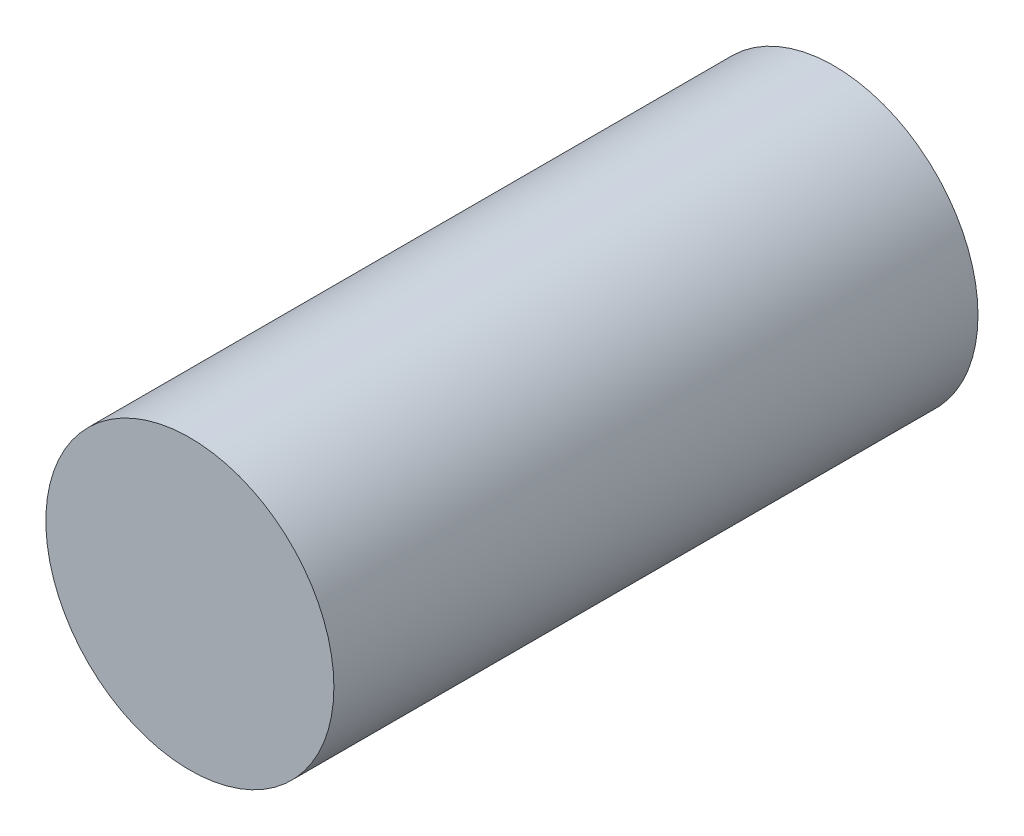
ISO-10303-21;
HEADER;
FILE_DESCRIPTION(('STEP AP214'),'2;1');
FILE_NAME('part.step','',(''),(''),'','','');
FILE_SCHEMA(('AUTOMOTIVE_DESIGN { 1 0 10303 214 1 1 1 1 }'));
ENDSEC;
DATA;
#1=APPLICATION_CONTEXT('core data for automotive mechanical design processes');
#2=APPLICATION_PROTOCOL_DEFINITION('international standard','automotive_design',2000,#1);
#3=PRODUCT_CONTEXT('',#1,'mechanical');
#4=PRODUCT('Part','Part','',(#3));
#5=PRODUCT_RELATED_PRODUCT_CATEGORY('part','',(#4));
#6=PRODUCT_DEFINITION_FORMATION('','',#4);
#7=PRODUCT_DEFINITION_CONTEXT('part definition',#1,'design');
#8=PRODUCT_DEFINITION('design','',#6,#7);
#9=PRODUCT_DEFINITION_SHAPE('','',#8);
#10=(LENGTH_UNIT() NAMED_UNIT(*) SI_UNIT(.MILLI.,.METRE.));
#11=(NAMED_UNIT(*) PLANE_ANGLE_UNIT() SI_UNIT($,.RADIAN.));
#12=(NAMED_UNIT(*) SI_UNIT($,.STERADIAN.) SOLID_ANGLE_UNIT());
#13=UNCERTAINTY_MEASURE_WITH_UNIT(LENGTH_MEASURE(1.E-05),#10,'distance_accuracy_value','');
#14=(GEOMETRIC_REPRESENTATION_CONTEXT(3) GLOBAL_UNCERTAINTY_ASSIGNED_CONTEXT((#13)) GLOBAL_UNIT_ASSIGNED_CONTEXT((#10,
#11,#12)) REPRESENTATION_CONTEXT('',''));
#15=CARTESIAN_POINT('',(0.,0.,0.));
#16=DIRECTION('',(0.,0.,1.));
#17=DIRECTION('',(1.,0.,0.));
#18=AXIS2_PLACEMENT_3D('',#15,#16,#17);
#19=CARTESIAN_POINT('',(0.,0.,80.5));
#20=DIRECTION('',(0.,0.,-1.));
#21=DIRECTION('',(-1.,0.,0.));
#22=AXIS2_PLACEMENT_3D('',#19,#20,#21);
#23=CYLINDRICAL_SURFACE('',#22,18.);
#24=CARTESIAN_POINT('',(0.,0.,80.5));
#25=DIRECTION('',(0.,0.,1.));
#26=DIRECTION('',(1.,0.,0.));
#27=AXIS2_PLACEMENT_3D('',#24,#25,#26);
#28=CIRCLE('',#27,18.);
#29=CARTESIAN_POINT('',(18.,0.,80.5));
#30=VERTEX_POINT('',#29);
#31=EDGE_CURVE('E36',#30,#30,#28,.T.);
#32=ORIENTED_EDGE('',*,*,#31,.F.);
#33=EDGE_LOOP('',(#32));
#34=FACE_BOUND('',#33,.T.);
#35=CARTESIAN_POINT('',(0.,0.,0.));
#36=DIRECTION('',(0.,0.,1.));
#37=DIRECTION('',(1.,0.,0.));
#38=AXIS2_PLACEMENT_3D('',#35,#36,#37);
#39=CIRCLE('',#38,18.);
#40=CARTESIAN_POINT('',(18.,0.,0.));
#41=VERTEX_POINT('',#40);
#42=EDGE_CURVE('E40',#41,#41,#39,.T.);
#43=ORIENTED_EDGE('',*,*,#42,.T.);
#44=EDGE_LOOP('',(#43));
#45=FACE_BOUND('',#44,.T.);
#46=ADVANCED_FACE('F30',(#34,#45),#23,.T.);
#47=CARTESIAN_POINT('',(0.,0.,80.5));
#48=DIRECTION('',(0.,0.,1.));
#49=DIRECTION('',(1.,0.,0.));
#50=AXIS2_PLACEMENT_3D('',#47,#48,#49);
#51=PLANE('',#50);
#52=ORIENTED_EDGE('',*,*,#31,.T.);
#53=EDGE_LOOP('',(#52));
#54=FACE_BOUND('',#53,.T.);
#55=ADVANCED_FACE('F61',(#54),#51,.T.);
#56=CARTESIAN_POINT('',(0.,0.,0.));
#57=DIRECTION('',(0.,0.,1.));
#58=DIRECTION('',(1.,0.,0.));
#59=AXIS2_PLACEMENT_3D('',#56,#57,#58);
#60=PLANE('',#59);
#61=CARTESIAN_POINT('',(0.,-8.76714854485821,0.));
#62=DIRECTION('',(0.,0.,1.));
#63=DIRECTION('',(1.,0.,0.));
#64=AXIS2_PLACEMENT_3D('',#61,#62,#63);
#65=CIRCLE('',#64,6.);
#66=CARTESIAN_POINT('',(6.,-8.76714854485821,0.));
#67=VERTEX_POINT('',#66);
#68=EDGE_CURVE('E10',#67,#67,#65,.F.);
#69=ORIENTED_EDGE('',*,*,#68,.F.);
#70=EDGE_LOOP('',(#69));
#71=FACE_BOUND('',#70,.T.);
#72=ORIENTED_EDGE('',*,*,#42,.F.);
#73=EDGE_LOOP('',(#72));
#74=FACE_BOUND('',#73,.T.);
#75=ADVANCED_FACE('F54',(#71,#74),#60,.F.);
#76=CARTESIAN_POINT('',(0.,-8.76714854485821,-6.8));
#77=DIRECTION('',(0.,0.,1.));
#78=DIRECTION('',(1.,0.,0.));
#79=AXIS2_PLACEMENT_3D('',#76,#77,#78);
#80=CYLINDRICAL_SURFACE('',#79,6.);
#81=CARTESIAN_POINT('',(0.,-8.76714854485821,-6.8));
#82=DIRECTION('',(0.,0.,-1.));
#83=DIRECTION('',(-1.,0.,0.));
#84=AXIS2_PLACEMENT_3D('',#81,#82,#83);
#85=CIRCLE('',#84,6.);
#86=CARTESIAN_POINT('',(-6.,-8.76714854485821,-6.8));
#87=VERTEX_POINT('',#86);
#88=EDGE_CURVE('E45',#87,#87,#85,.T.);
#89=ORIENTED_EDGE('',*,*,#88,.F.);
#90=EDGE_LOOP('',(#89));
#91=FACE_BOUND('',#90,.T.);
#92=ORIENTED_EDGE('',*,*,#68,.T.);
#93=EDGE_LOOP('',(#92));
#94=FACE_BOUND('',#93,.T.);
#95=ADVANCED_FACE('F52',(#91,#94),#80,.T.);
#96=CARTESIAN_POINT('',(0.,-8.76714854485821,-6.8));
#97=DIRECTION('',(0.,0.,-1.));
#98=DIRECTION('',(-1.,0.,0.));
#99=AXIS2_PLACEMENT_3D('',#96,#97,#98);
#100=PLANE('',#99);
#101=ORIENTED_EDGE('',*,*,#88,.T.);
#102=EDGE_LOOP('',(#101));
#103=FACE_BOUND('',#102,.T.);
#104=ADVANCED_FACE('F50',(#103),#100,.T.);
#105=CLOSED_SHELL('',(#46,#55,#75,#95,#104));
#106=MANIFOLD_SOLID_BREP('B2',#105);
#107=ADVANCED_BREP_SHAPE_REPRESENTATION('',(#18,#106),#14);
#108=SHAPE_DEFINITION_REPRESENTATION(#9,#107);
ENDSEC;
END-ISO-10303-21;
